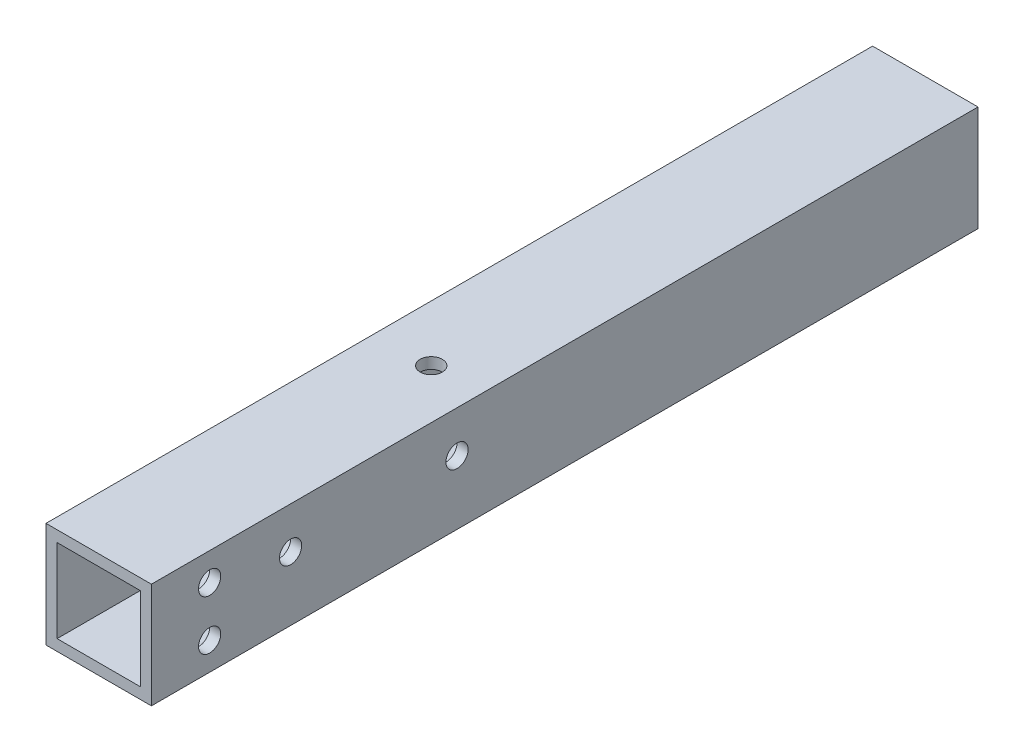
ISO-10303-21;
HEADER;
FILE_DESCRIPTION(('STEP AP214'),'2;1');
FILE_NAME('part.step','',(''),(''),'','','');
FILE_SCHEMA(('AUTOMOTIVE_DESIGN { 1 0 10303 214 1 1 1 1 }'));
ENDSEC;
DATA;
#1=APPLICATION_CONTEXT('core data for automotive mechanical design processes');
#2=APPLICATION_PROTOCOL_DEFINITION('international standard','automotive_design',2000,#1);
#3=PRODUCT_CONTEXT('',#1,'mechanical');
#4=PRODUCT('Part','Part','',(#3));
#5=PRODUCT_RELATED_PRODUCT_CATEGORY('part','',(#4));
#6=PRODUCT_DEFINITION_FORMATION('','',#4);
#7=PRODUCT_DEFINITION_CONTEXT('part definition',#1,'design');
#8=PRODUCT_DEFINITION('design','',#6,#7);
#9=PRODUCT_DEFINITION_SHAPE('','',#8);
#10=(LENGTH_UNIT() NAMED_UNIT(*) SI_UNIT(.MILLI.,.METRE.));
#11=(NAMED_UNIT(*) PLANE_ANGLE_UNIT() SI_UNIT($,.RADIAN.));
#12=(NAMED_UNIT(*) SI_UNIT($,.STERADIAN.) SOLID_ANGLE_UNIT());
#13=UNCERTAINTY_MEASURE_WITH_UNIT(LENGTH_MEASURE(1.E-05),#10,'distance_accuracy_value','');
#14=(GEOMETRIC_REPRESENTATION_CONTEXT(3) GLOBAL_UNCERTAINTY_ASSIGNED_CONTEXT((#13)) GLOBAL_UNIT_ASSIGNED_CONTEXT((#10,
#11,#12)) REPRESENTATION_CONTEXT('',''));
#15=CARTESIAN_POINT('',(0.,0.,0.));
#16=DIRECTION('',(0.,0.,1.));
#17=DIRECTION('',(1.,0.,0.));
#18=AXIS2_PLACEMENT_3D('',#15,#16,#17);
#19=CARTESIAN_POINT('',(0.,0.,149.));
#20=DIRECTION('',(0.,0.,-1.));
#21=DIRECTION('',(-1.,0.,0.));
#22=AXIS2_PLACEMENT_3D('',#19,#20,#21);
#23=PLANE('',#22);
#24=DIRECTION('',(0.,1.,0.));
#25=VECTOR('',#24,1.);
#26=CARTESIAN_POINT('',(9.5,-9.5,149.));
#27=LINE('',#26,#25);
#28=CARTESIAN_POINT('',(9.5,-9.5,149.));
#29=VERTEX_POINT('',#28);
#30=CARTESIAN_POINT('',(9.5,9.5,149.));
#31=VERTEX_POINT('',#30);
#32=EDGE_CURVE('E142',#29,#31,#27,.T.);
#33=ORIENTED_EDGE('',*,*,#32,.T.);
#34=DIRECTION('',(-1.,0.,0.));
#35=VECTOR('',#34,1.);
#36=CARTESIAN_POINT('',(-9.5,9.5,149.));
#37=LINE('',#36,#35);
#38=CARTESIAN_POINT('',(-9.5,9.5,149.));
#39=VERTEX_POINT('',#38);
#40=EDGE_CURVE('E145',#31,#39,#37,.T.);
#41=ORIENTED_EDGE('',*,*,#40,.T.);
#42=DIRECTION('',(0.,-1.,0.));
#43=VECTOR('',#42,1.);
#44=CARTESIAN_POINT('',(-9.5,-9.5,149.));
#45=LINE('',#44,#43);
#46=CARTESIAN_POINT('',(-9.5,-9.5,149.));
#47=VERTEX_POINT('',#46);
#48=EDGE_CURVE('E148',#39,#47,#45,.T.);
#49=ORIENTED_EDGE('',*,*,#48,.T.);
#50=DIRECTION('',(1.,0.,0.));
#51=VECTOR('',#50,1.);
#52=CARTESIAN_POINT('',(-9.5,-9.5,149.));
#53=LINE('',#52,#51);
#54=EDGE_CURVE('E150',#47,#29,#53,.T.);
#55=ORIENTED_EDGE('',*,*,#54,.T.);
#56=EDGE_LOOP('',(#33,#41,#49,#55));
#57=FACE_BOUND('',#56,.T.);
#58=DIRECTION('',(0.,-1.,0.));
#59=VECTOR('',#58,1.);
#60=CARTESIAN_POINT('',(-7.5,-7.5,149.));
#61=LINE('',#60,#59);
#62=CARTESIAN_POINT('',(-7.5,7.5,149.));
#63=VERTEX_POINT('',#62);
#64=CARTESIAN_POINT('',(-7.5,-7.5,149.));
#65=VERTEX_POINT('',#64);
#66=EDGE_CURVE('E104',#63,#65,#61,.T.);
#67=ORIENTED_EDGE('',*,*,#66,.F.);
#68=DIRECTION('',(-1.,0.,0.));
#69=VECTOR('',#68,1.);
#70=CARTESIAN_POINT('',(-7.5,7.5,149.));
#71=LINE('',#70,#69);
#72=CARTESIAN_POINT('',(7.5,7.5,149.));
#73=VERTEX_POINT('',#72);
#74=EDGE_CURVE('E126',#73,#63,#71,.T.);
#75=ORIENTED_EDGE('',*,*,#74,.F.);
#76=DIRECTION('',(0.,1.,0.));
#77=VECTOR('',#76,1.);
#78=CARTESIAN_POINT('',(7.5,-7.5,149.));
#79=LINE('',#78,#77);
#80=CARTESIAN_POINT('',(7.5,-7.5,149.));
#81=VERTEX_POINT('',#80);
#82=EDGE_CURVE('E124',#81,#73,#79,.T.);
#83=ORIENTED_EDGE('',*,*,#82,.F.);
#84=DIRECTION('',(1.,0.,0.));
#85=VECTOR('',#84,1.);
#86=CARTESIAN_POINT('',(-7.5,-7.5,149.));
#87=LINE('',#86,#85);
#88=EDGE_CURVE('E112',#65,#81,#87,.T.);
#89=ORIENTED_EDGE('',*,*,#88,.F.);
#90=EDGE_LOOP('',(#67,#75,#83,#89));
#91=FACE_BOUND('',#90,.T.);
#92=ADVANCED_FACE('F37',(#57,#91),#23,.F.);
#93=CARTESIAN_POINT('',(0.,0.,0.));
#94=DIRECTION('',(0.,0.,-1.));
#95=DIRECTION('',(-1.,0.,0.));
#96=AXIS2_PLACEMENT_3D('',#93,#94,#95);
#97=PLANE('',#96);
#98=DIRECTION('',(0.,1.,0.));
#99=VECTOR('',#98,1.);
#100=CARTESIAN_POINT('',(9.5,-9.5,0.));
#101=LINE('',#100,#99);
#102=CARTESIAN_POINT('',(9.5,-9.5,0.));
#103=VERTEX_POINT('',#102);
#104=CARTESIAN_POINT('',(9.5,9.5,0.));
#105=VERTEX_POINT('',#104);
#106=EDGE_CURVE('E120',#103,#105,#101,.T.);
#107=ORIENTED_EDGE('',*,*,#106,.F.);
#108=DIRECTION('',(1.,0.,0.));
#109=VECTOR('',#108,1.);
#110=CARTESIAN_POINT('',(-9.5,-9.5,0.));
#111=LINE('',#110,#109);
#112=CARTESIAN_POINT('',(-9.5,-9.5,0.));
#113=VERTEX_POINT('',#112);
#114=EDGE_CURVE('E146',#113,#103,#111,.T.);
#115=ORIENTED_EDGE('',*,*,#114,.F.);
#116=DIRECTION('',(0.,-1.,0.));
#117=VECTOR('',#116,1.);
#118=CARTESIAN_POINT('',(-9.5,-9.5,0.));
#119=LINE('',#118,#117);
#120=CARTESIAN_POINT('',(-9.5,9.5,0.));
#121=VERTEX_POINT('',#120);
#122=EDGE_CURVE('E157',#121,#113,#119,.T.);
#123=ORIENTED_EDGE('',*,*,#122,.F.);
#124=DIRECTION('',(-1.,0.,0.));
#125=VECTOR('',#124,1.);
#126=CARTESIAN_POINT('',(-9.5,9.5,0.));
#127=LINE('',#126,#125);
#128=EDGE_CURVE('E155',#105,#121,#127,.T.);
#129=ORIENTED_EDGE('',*,*,#128,.F.);
#130=EDGE_LOOP('',(#107,#115,#123,#129));
#131=FACE_BOUND('',#130,.T.);
#132=DIRECTION('',(-1.,0.,0.));
#133=VECTOR('',#132,1.);
#134=CARTESIAN_POINT('',(-7.5,7.5,0.));
#135=LINE('',#134,#133);
#136=CARTESIAN_POINT('',(7.5,7.5,0.));
#137=VERTEX_POINT('',#136);
#138=CARTESIAN_POINT('',(-7.5,7.5,0.));
#139=VERTEX_POINT('',#138);
#140=EDGE_CURVE('E113',#137,#139,#135,.T.);
#141=ORIENTED_EDGE('',*,*,#140,.T.);
#142=DIRECTION('',(0.,-1.,0.));
#143=VECTOR('',#142,1.);
#144=CARTESIAN_POINT('',(-7.5,-7.5,0.));
#145=LINE('',#144,#143);
#146=CARTESIAN_POINT('',(-7.5,-7.5,0.));
#147=VERTEX_POINT('',#146);
#148=EDGE_CURVE('E62',#139,#147,#145,.T.);
#149=ORIENTED_EDGE('',*,*,#148,.T.);
#150=DIRECTION('',(1.,0.,0.));
#151=VECTOR('',#150,1.);
#152=CARTESIAN_POINT('',(-7.5,-7.5,0.));
#153=LINE('',#152,#151);
#154=CARTESIAN_POINT('',(7.5,-7.5,0.));
#155=VERTEX_POINT('',#154);
#156=EDGE_CURVE('E119',#147,#155,#153,.T.);
#157=ORIENTED_EDGE('',*,*,#156,.T.);
#158=DIRECTION('',(0.,1.,0.));
#159=VECTOR('',#158,1.);
#160=CARTESIAN_POINT('',(7.5,-7.5,0.));
#161=LINE('',#160,#159);
#162=EDGE_CURVE('E134',#155,#137,#161,.T.);
#163=ORIENTED_EDGE('',*,*,#162,.T.);
#164=EDGE_LOOP('',(#141,#149,#157,#163));
#165=FACE_BOUND('',#164,.T.);
#166=ADVANCED_FACE('F219',(#131,#165),#97,.T.);
#167=CARTESIAN_POINT('',(9.5,-9.5,149.));
#168=DIRECTION('',(-1.,0.,0.));
#169=DIRECTION('',(0.,0.,1.));
#170=AXIS2_PLACEMENT_3D('',#167,#168,#169);
#171=PLANE('',#170);
#172=CARTESIAN_POINT('',(9.5,2.,93.91));
#173=DIRECTION('',(-1.,0.,0.));
#174=DIRECTION('',(0.,0.,1.));
#175=AXIS2_PLACEMENT_3D('',#172,#173,#174);
#176=CIRCLE('',#175,2.);
#177=CARTESIAN_POINT('',(9.5,2.,95.91));
#178=VERTEX_POINT('',#177);
#179=EDGE_CURVE('E180',#178,#178,#176,.T.);
#180=ORIENTED_EDGE('',*,*,#179,.T.);
#181=EDGE_LOOP('',(#180));
#182=FACE_BOUND('',#181,.T.);
#183=CARTESIAN_POINT('',(9.5,2.,123.91));
#184=DIRECTION('',(-1.,0.,0.));
#185=DIRECTION('',(0.,0.,1.));
#186=AXIS2_PLACEMENT_3D('',#183,#184,#185);
#187=CIRCLE('',#186,2.);
#188=CARTESIAN_POINT('',(9.5,2.,125.91));
#189=VERTEX_POINT('',#188);
#190=EDGE_CURVE('E196',#189,#189,#187,.T.);
#191=ORIENTED_EDGE('',*,*,#190,.T.);
#192=EDGE_LOOP('',(#191));
#193=FACE_BOUND('',#192,.T.);
#194=CARTESIAN_POINT('',(9.5,4.50000000000178,138.5));
#195=DIRECTION('',(1.,0.,0.));
#196=DIRECTION('',(0.,0.,-1.));
#197=AXIS2_PLACEMENT_3D('',#194,#195,#196);
#198=CIRCLE('',#197,1.99999999999808);
#199=CARTESIAN_POINT('',(9.5,4.50000000000178,136.500000000002));
#200=VERTEX_POINT('',#199);
#201=EDGE_CURVE('E170',#200,#200,#198,.T.);
#202=ORIENTED_EDGE('',*,*,#201,.F.);
#203=EDGE_LOOP('',(#202));
#204=FACE_BOUND('',#203,.T.);
#205=CARTESIAN_POINT('',(9.5,-4.49999999999823,138.5));
#206=DIRECTION('',(1.,0.,0.));
#207=DIRECTION('',(0.,0.,-1.));
#208=AXIS2_PLACEMENT_3D('',#205,#206,#207);
#209=CIRCLE('',#208,1.99999999999808);
#210=CARTESIAN_POINT('',(9.5,-4.49999999999823,136.500000000002));
#211=VERTEX_POINT('',#210);
#212=EDGE_CURVE('E209',#211,#211,#209,.T.);
#213=ORIENTED_EDGE('',*,*,#212,.F.);
#214=EDGE_LOOP('',(#213));
#215=FACE_BOUND('',#214,.T.);
#216=ORIENTED_EDGE('',*,*,#106,.T.);
#217=DIRECTION('',(0.,0.,-1.));
#218=VECTOR('',#217,1.);
#219=CARTESIAN_POINT('',(9.5,9.5,149.));
#220=LINE('',#219,#218);
#221=EDGE_CURVE('E11',#31,#105,#220,.T.);
#222=ORIENTED_EDGE('',*,*,#221,.F.);
#223=ORIENTED_EDGE('',*,*,#32,.F.);
#224=DIRECTION('',(0.,0.,-1.));
#225=VECTOR('',#224,1.);
#226=CARTESIAN_POINT('',(9.5,-9.5,149.));
#227=LINE('',#226,#225);
#228=EDGE_CURVE('E152',#29,#103,#227,.T.);
#229=ORIENTED_EDGE('',*,*,#228,.T.);
#230=EDGE_LOOP('',(#216,#222,#223,#229));
#231=FACE_BOUND('',#230,.T.);
#232=ADVANCED_FACE('F39',(#182,#193,#204,#215,#231),#171,.F.);
#233=CARTESIAN_POINT('',(-9.5,9.5,149.));
#234=DIRECTION('',(0.,-1.,0.));
#235=DIRECTION('',(0.,0.,-1.));
#236=AXIS2_PLACEMENT_3D('',#233,#234,#235);
#237=PLANE('',#236);
#238=CARTESIAN_POINT('',(0.609999999999999,9.5,89.67));
#239=DIRECTION('',(0.,1.,0.));
#240=DIRECTION('',(0.,0.,1.));
#241=AXIS2_PLACEMENT_3D('',#238,#239,#240);
#242=CIRCLE('',#241,2.);
#243=CARTESIAN_POINT('',(0.609999999999999,9.5,91.67));
#244=VERTEX_POINT('',#243);
#245=EDGE_CURVE('E202',#244,#244,#242,.T.);
#246=ORIENTED_EDGE('',*,*,#245,.F.);
#247=EDGE_LOOP('',(#246));
#248=FACE_BOUND('',#247,.T.);
#249=ORIENTED_EDGE('',*,*,#128,.T.);
#250=DIRECTION('',(0.,0.,-1.));
#251=VECTOR('',#250,1.);
#252=CARTESIAN_POINT('',(-9.5,9.5,149.));
#253=LINE('',#252,#251);
#254=EDGE_CURVE('E46',#39,#121,#253,.T.);
#255=ORIENTED_EDGE('',*,*,#254,.F.);
#256=ORIENTED_EDGE('',*,*,#40,.F.);
#257=ORIENTED_EDGE('',*,*,#221,.T.);
#258=EDGE_LOOP('',(#249,#255,#256,#257));
#259=FACE_BOUND('',#258,.T.);
#260=ADVANCED_FACE('F218',(#248,#259),#237,.F.);
#261=CARTESIAN_POINT('',(-9.5,-9.5,149.));
#262=DIRECTION('',(1.,0.,0.));
#263=DIRECTION('',(0.,0.,-1.));
#264=AXIS2_PLACEMENT_3D('',#261,#262,#263);
#265=PLANE('',#264);
#266=CARTESIAN_POINT('',(-9.5,2.,93.91));
#267=DIRECTION('',(-1.,0.,0.));
#268=DIRECTION('',(0.,0.,1.));
#269=AXIS2_PLACEMENT_3D('',#266,#267,#268);
#270=CIRCLE('',#269,2.);
#271=CARTESIAN_POINT('',(-9.5,2.,95.91));
#272=VERTEX_POINT('',#271);
#273=EDGE_CURVE('E186',#272,#272,#270,.T.);
#274=ORIENTED_EDGE('',*,*,#273,.F.);
#275=EDGE_LOOP('',(#274));
#276=FACE_BOUND('',#275,.T.);
#277=CARTESIAN_POINT('',(-9.5,2.,123.91));
#278=DIRECTION('',(-1.,0.,0.));
#279=DIRECTION('',(0.,0.,1.));
#280=AXIS2_PLACEMENT_3D('',#277,#278,#279);
#281=CIRCLE('',#280,2.);
#282=CARTESIAN_POINT('',(-9.5,2.,125.91));
#283=VERTEX_POINT('',#282);
#284=EDGE_CURVE('E191',#283,#283,#281,.T.);
#285=ORIENTED_EDGE('',*,*,#284,.F.);
#286=EDGE_LOOP('',(#285));
#287=FACE_BOUND('',#286,.T.);
#288=ORIENTED_EDGE('',*,*,#122,.T.);
#289=DIRECTION('',(0.,0.,-1.));
#290=VECTOR('',#289,1.);
#291=CARTESIAN_POINT('',(-9.5,-9.5,149.));
#292=LINE('',#291,#290);
#293=EDGE_CURVE('E162',#47,#113,#292,.T.);
#294=ORIENTED_EDGE('',*,*,#293,.F.);
#295=ORIENTED_EDGE('',*,*,#48,.F.);
#296=ORIENTED_EDGE('',*,*,#254,.T.);
#297=EDGE_LOOP('',(#288,#294,#295,#296));
#298=FACE_BOUND('',#297,.T.);
#299=ADVANCED_FACE('F237',(#276,#287,#298),#265,.F.);
#300=CARTESIAN_POINT('',(-9.5,-9.5,149.));
#301=DIRECTION('',(0.,1.,0.));
#302=DIRECTION('',(0.,0.,1.));
#303=AXIS2_PLACEMENT_3D('',#300,#301,#302);
#304=PLANE('',#303);
#305=CARTESIAN_POINT('',(0.609999999999999,-9.5,89.67));
#306=DIRECTION('',(0.,1.,0.));
#307=DIRECTION('',(0.,0.,1.));
#308=AXIS2_PLACEMENT_3D('',#305,#306,#307);
#309=CIRCLE('',#308,2.);
#310=CARTESIAN_POINT('',(0.609999999999999,-9.5,91.67));
#311=VERTEX_POINT('',#310);
#312=EDGE_CURVE('E176',#311,#311,#309,.T.);
#313=ORIENTED_EDGE('',*,*,#312,.T.);
#314=EDGE_LOOP('',(#313));
#315=FACE_BOUND('',#314,.T.);
#316=ORIENTED_EDGE('',*,*,#114,.T.);
#317=ORIENTED_EDGE('',*,*,#228,.F.);
#318=ORIENTED_EDGE('',*,*,#54,.F.);
#319=ORIENTED_EDGE('',*,*,#293,.T.);
#320=EDGE_LOOP('',(#316,#317,#318,#319));
#321=FACE_BOUND('',#320,.T.);
#322=ADVANCED_FACE('F235',(#315,#321),#304,.F.);
#323=CARTESIAN_POINT('',(-7.5,-7.5,149.));
#324=DIRECTION('',(1.,0.,0.));
#325=DIRECTION('',(0.,0.,-1.));
#326=AXIS2_PLACEMENT_3D('',#323,#324,#325);
#327=PLANE('',#326);
#328=CARTESIAN_POINT('',(-7.5,2.,93.91));
#329=DIRECTION('',(1.,0.,0.));
#330=DIRECTION('',(0.,0.,-1.));
#331=AXIS2_PLACEMENT_3D('',#328,#329,#330);
#332=CIRCLE('',#331,2.);
#333=CARTESIAN_POINT('',(-7.5,2.,91.91));
#334=VERTEX_POINT('',#333);
#335=EDGE_CURVE('E199',#334,#334,#332,.T.);
#336=ORIENTED_EDGE('',*,*,#335,.F.);
#337=EDGE_LOOP('',(#336));
#338=FACE_BOUND('',#337,.T.);
#339=CARTESIAN_POINT('',(-7.5,2.,123.91));
#340=DIRECTION('',(1.,0.,0.));
#341=DIRECTION('',(0.,0.,-1.));
#342=AXIS2_PLACEMENT_3D('',#339,#340,#341);
#343=CIRCLE('',#342,2.);
#344=CARTESIAN_POINT('',(-7.5,2.,121.91));
#345=VERTEX_POINT('',#344);
#346=EDGE_CURVE('E179',#345,#345,#343,.T.);
#347=ORIENTED_EDGE('',*,*,#346,.F.);
#348=EDGE_LOOP('',(#347));
#349=FACE_BOUND('',#348,.T.);
#350=ORIENTED_EDGE('',*,*,#148,.F.);
#351=DIRECTION('',(0.,0.,-1.));
#352=VECTOR('',#351,1.);
#353=CARTESIAN_POINT('',(-7.5,7.5,149.));
#354=LINE('',#353,#352);
#355=EDGE_CURVE('E108',#63,#139,#354,.T.);
#356=ORIENTED_EDGE('',*,*,#355,.F.);
#357=ORIENTED_EDGE('',*,*,#66,.T.);
#358=DIRECTION('',(0.,0.,-1.));
#359=VECTOR('',#358,1.);
#360=CARTESIAN_POINT('',(-7.5,-7.5,149.));
#361=LINE('',#360,#359);
#362=EDGE_CURVE('E107',#65,#147,#361,.T.);
#363=ORIENTED_EDGE('',*,*,#362,.T.);
#364=EDGE_LOOP('',(#350,#356,#357,#363));
#365=FACE_BOUND('',#364,.T.);
#366=ADVANCED_FACE('F106',(#338,#349,#365),#327,.T.);
#367=CARTESIAN_POINT('',(-7.5,-7.5,149.));
#368=DIRECTION('',(0.,1.,0.));
#369=DIRECTION('',(0.,0.,1.));
#370=AXIS2_PLACEMENT_3D('',#367,#368,#369);
#371=PLANE('',#370);
#372=CARTESIAN_POINT('',(0.609999999999999,-7.5,89.67));
#373=DIRECTION('',(0.,1.,0.));
#374=DIRECTION('',(0.,0.,1.));
#375=AXIS2_PLACEMENT_3D('',#372,#373,#374);
#376=CIRCLE('',#375,2.);
#377=CARTESIAN_POINT('',(0.609999999999999,-7.5,91.67));
#378=VERTEX_POINT('',#377);
#379=EDGE_CURVE('E175',#378,#378,#376,.T.);
#380=ORIENTED_EDGE('',*,*,#379,.F.);
#381=EDGE_LOOP('',(#380));
#382=FACE_BOUND('',#381,.T.);
#383=ORIENTED_EDGE('',*,*,#156,.F.);
#384=ORIENTED_EDGE('',*,*,#362,.F.);
#385=ORIENTED_EDGE('',*,*,#88,.T.);
#386=DIRECTION('',(0.,0.,-1.));
#387=VECTOR('',#386,1.);
#388=CARTESIAN_POINT('',(7.5,-7.5,149.));
#389=LINE('',#388,#387);
#390=EDGE_CURVE('E121',#81,#155,#389,.T.);
#391=ORIENTED_EDGE('',*,*,#390,.T.);
#392=EDGE_LOOP('',(#383,#384,#385,#391));
#393=FACE_BOUND('',#392,.T.);
#394=ADVANCED_FACE('F116',(#382,#393),#371,.T.);
#395=CARTESIAN_POINT('',(7.5,-7.5,149.));
#396=DIRECTION('',(-1.,0.,0.));
#397=DIRECTION('',(0.,0.,1.));
#398=AXIS2_PLACEMENT_3D('',#395,#396,#397);
#399=PLANE('',#398);
#400=CARTESIAN_POINT('',(7.5,2.,93.91));
#401=DIRECTION('',(-1.,0.,0.));
#402=DIRECTION('',(0.,0.,1.));
#403=AXIS2_PLACEMENT_3D('',#400,#401,#402);
#404=CIRCLE('',#403,2.);
#405=CARTESIAN_POINT('',(7.5,2.,95.91));
#406=VERTEX_POINT('',#405);
#407=EDGE_CURVE('E41',#406,#406,#404,.T.);
#408=ORIENTED_EDGE('',*,*,#407,.F.);
#409=EDGE_LOOP('',(#408));
#410=FACE_BOUND('',#409,.T.);
#411=CARTESIAN_POINT('',(7.5,2.,123.91));
#412=DIRECTION('',(-1.,0.,0.));
#413=DIRECTION('',(0.,0.,1.));
#414=AXIS2_PLACEMENT_3D('',#411,#412,#413);
#415=CIRCLE('',#414,2.);
#416=CARTESIAN_POINT('',(7.5,2.,125.91));
#417=VERTEX_POINT('',#416);
#418=EDGE_CURVE('E177',#417,#417,#415,.T.);
#419=ORIENTED_EDGE('',*,*,#418,.F.);
#420=EDGE_LOOP('',(#419));
#421=FACE_BOUND('',#420,.T.);
#422=CARTESIAN_POINT('',(7.5,4.50000000000178,138.5));
#423=DIRECTION('',(-1.,0.,0.));
#424=DIRECTION('',(0.,0.,1.));
#425=AXIS2_PLACEMENT_3D('',#422,#423,#424);
#426=CIRCLE('',#425,1.99999999999808);
#427=CARTESIAN_POINT('',(7.5,4.50000000000178,140.499999999998));
#428=VERTEX_POINT('',#427);
#429=EDGE_CURVE('E132',#428,#428,#426,.T.);
#430=ORIENTED_EDGE('',*,*,#429,.F.);
#431=EDGE_LOOP('',(#430));
#432=FACE_BOUND('',#431,.T.);
#433=CARTESIAN_POINT('',(7.5,-4.49999999999823,138.5));
#434=DIRECTION('',(-1.,0.,0.));
#435=DIRECTION('',(0.,0.,1.));
#436=AXIS2_PLACEMENT_3D('',#433,#434,#435);
#437=CIRCLE('',#436,1.99999999999808);
#438=CARTESIAN_POINT('',(7.5,-4.49999999999823,140.499999999998));
#439=VERTEX_POINT('',#438);
#440=EDGE_CURVE('E167',#439,#439,#437,.T.);
#441=ORIENTED_EDGE('',*,*,#440,.F.);
#442=EDGE_LOOP('',(#441));
#443=FACE_BOUND('',#442,.T.);
#444=ORIENTED_EDGE('',*,*,#162,.F.);
#445=ORIENTED_EDGE('',*,*,#390,.F.);
#446=ORIENTED_EDGE('',*,*,#82,.T.);
#447=DIRECTION('',(0.,0.,-1.));
#448=VECTOR('',#447,1.);
#449=CARTESIAN_POINT('',(7.5,7.5,149.));
#450=LINE('',#449,#448);
#451=EDGE_CURVE('E54',#73,#137,#450,.T.);
#452=ORIENTED_EDGE('',*,*,#451,.T.);
#453=EDGE_LOOP('',(#444,#445,#446,#452));
#454=FACE_BOUND('',#453,.T.);
#455=ADVANCED_FACE('F262',(#410,#421,#432,#443,#454),#399,.T.);
#456=CARTESIAN_POINT('',(-7.5,7.5,149.));
#457=DIRECTION('',(0.,-1.,0.));
#458=DIRECTION('',(1.,0.,0.));
#459=AXIS2_PLACEMENT_3D('',#456,#457,#458);
#460=PLANE('',#459);
#461=CARTESIAN_POINT('',(0.609999999999999,7.5,89.67));
#462=DIRECTION('',(0.,-1.,0.));
#463=DIRECTION('',(1.,0.,0.));
#464=AXIS2_PLACEMENT_3D('',#461,#462,#463);
#465=CIRCLE('',#464,2.);
#466=CARTESIAN_POINT('',(2.61,7.5,89.67));
#467=VERTEX_POINT('',#466);
#468=EDGE_CURVE('E173',#467,#467,#465,.T.);
#469=ORIENTED_EDGE('',*,*,#468,.F.);
#470=EDGE_LOOP('',(#469));
#471=FACE_BOUND('',#470,.T.);
#472=ORIENTED_EDGE('',*,*,#140,.F.);
#473=ORIENTED_EDGE('',*,*,#451,.F.);
#474=ORIENTED_EDGE('',*,*,#74,.T.);
#475=ORIENTED_EDGE('',*,*,#355,.T.);
#476=EDGE_LOOP('',(#472,#473,#474,#475));
#477=FACE_BOUND('',#476,.T.);
#478=ADVANCED_FACE('F266',(#471,#477),#460,.T.);
#479=CARTESIAN_POINT('',(-0.5,-4.49999999999823,138.5));
#480=DIRECTION('',(1.,0.,0.));
#481=DIRECTION('',(0.,0.,-1.));
#482=AXIS2_PLACEMENT_3D('',#479,#480,#481);
#483=CYLINDRICAL_SURFACE('',#482,1.99999999999808);
#484=ORIENTED_EDGE('',*,*,#440,.T.);
#485=EDGE_LOOP('',(#484));
#486=FACE_BOUND('',#485,.T.);
#487=ORIENTED_EDGE('',*,*,#212,.T.);
#488=EDGE_LOOP('',(#487));
#489=FACE_BOUND('',#488,.T.);
#490=ADVANCED_FACE('F214',(#486,#489),#483,.F.);
#491=CARTESIAN_POINT('',(-0.5,4.50000000000178,138.5));
#492=DIRECTION('',(1.,0.,0.));
#493=DIRECTION('',(0.,0.,-1.));
#494=AXIS2_PLACEMENT_3D('',#491,#492,#493);
#495=CYLINDRICAL_SURFACE('',#494,1.99999999999808);
#496=ORIENTED_EDGE('',*,*,#429,.T.);
#497=EDGE_LOOP('',(#496));
#498=FACE_BOUND('',#497,.T.);
#499=ORIENTED_EDGE('',*,*,#201,.T.);
#500=EDGE_LOOP('',(#499));
#501=FACE_BOUND('',#500,.T.);
#502=ADVANCED_FACE('F273',(#498,#501),#495,.F.);
#503=CARTESIAN_POINT('',(0.609999999999999,-9.5,89.67));
#504=DIRECTION('',(0.,1.,0.));
#505=DIRECTION('',(0.,0.,1.));
#506=AXIS2_PLACEMENT_3D('',#503,#504,#505);
#507=CYLINDRICAL_SURFACE('',#506,2.);
#508=ORIENTED_EDGE('',*,*,#468,.T.);
#509=EDGE_LOOP('',(#508));
#510=FACE_BOUND('',#509,.T.);
#511=ORIENTED_EDGE('',*,*,#245,.T.);
#512=EDGE_LOOP('',(#511));
#513=FACE_BOUND('',#512,.T.);
#514=ADVANCED_FACE('F277',(#510,#513),#507,.F.);
#515=ORIENTED_EDGE('',*,*,#379,.T.);
#516=EDGE_LOOP('',(#515));
#517=FACE_BOUND('',#516,.T.);
#518=ORIENTED_EDGE('',*,*,#312,.F.);
#519=EDGE_LOOP('',(#518));
#520=FACE_BOUND('',#519,.T.);
#521=ADVANCED_FACE('F281',(#517,#520),#507,.F.);
#522=CARTESIAN_POINT('',(9.5,2.,123.91));
#523=DIRECTION('',(-1.,0.,0.));
#524=DIRECTION('',(0.,0.,1.));
#525=AXIS2_PLACEMENT_3D('',#522,#523,#524);
#526=CYLINDRICAL_SURFACE('',#525,2.);
#527=ORIENTED_EDGE('',*,*,#418,.T.);
#528=EDGE_LOOP('',(#527));
#529=FACE_BOUND('',#528,.T.);
#530=ORIENTED_EDGE('',*,*,#190,.F.);
#531=EDGE_LOOP('',(#530));
#532=FACE_BOUND('',#531,.T.);
#533=ADVANCED_FACE('F283',(#529,#532),#526,.F.);
#534=CARTESIAN_POINT('',(9.5,2.,93.91));
#535=DIRECTION('',(-1.,0.,0.));
#536=DIRECTION('',(0.,0.,1.));
#537=AXIS2_PLACEMENT_3D('',#534,#535,#536);
#538=CYLINDRICAL_SURFACE('',#537,2.);
#539=ORIENTED_EDGE('',*,*,#407,.T.);
#540=EDGE_LOOP('',(#539));
#541=FACE_BOUND('',#540,.T.);
#542=ORIENTED_EDGE('',*,*,#179,.F.);
#543=EDGE_LOOP('',(#542));
#544=FACE_BOUND('',#543,.T.);
#545=ADVANCED_FACE('F286',(#541,#544),#538,.F.);
#546=ORIENTED_EDGE('',*,*,#346,.T.);
#547=EDGE_LOOP('',(#546));
#548=FACE_BOUND('',#547,.T.);
#549=ORIENTED_EDGE('',*,*,#284,.T.);
#550=EDGE_LOOP('',(#549));
#551=FACE_BOUND('',#550,.T.);
#552=ADVANCED_FACE('F287',(#548,#551),#526,.F.);
#553=ORIENTED_EDGE('',*,*,#335,.T.);
#554=EDGE_LOOP('',(#553));
#555=FACE_BOUND('',#554,.T.);
#556=ORIENTED_EDGE('',*,*,#273,.T.);
#557=EDGE_LOOP('',(#556));
#558=FACE_BOUND('',#557,.T.);
#559=ADVANCED_FACE('F290',(#555,#558),#538,.F.);
#560=CLOSED_SHELL('',(#92,#166,#232,#260,#299,#322,#366,#394,#455,#478,#490,#502,#514,#521,#533,
#545,#552,#559));
#561=MANIFOLD_SOLID_BREP('B2',#560);
#562=ADVANCED_BREP_SHAPE_REPRESENTATION('',(#18,#561),#14);
#563=SHAPE_DEFINITION_REPRESENTATION(#9,#562);
ENDSEC;
END-ISO-10303-21;
